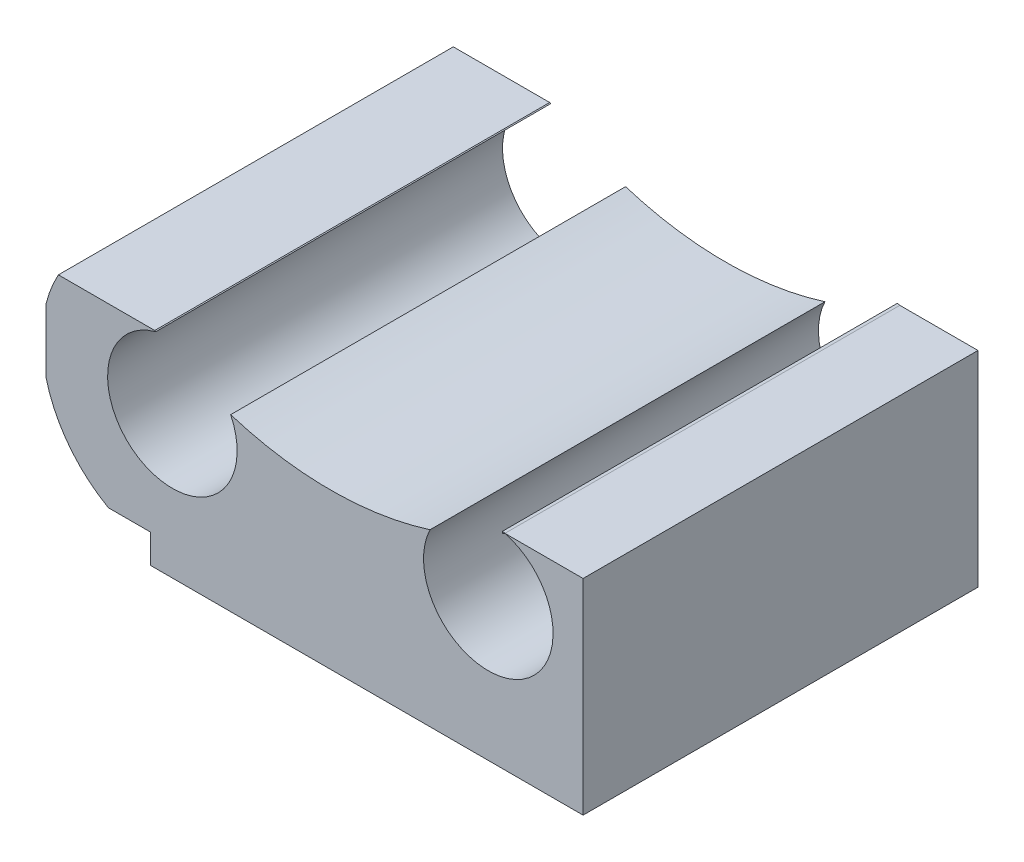
ISO-10303-21;
HEADER;
FILE_DESCRIPTION(('STEP AP214'),'2;1');
FILE_NAME('part.step','',(''),(''),'','','');
FILE_SCHEMA(('AUTOMOTIVE_DESIGN { 1 0 10303 214 1 1 1 1 }'));
ENDSEC;
DATA;
#1=APPLICATION_CONTEXT('core data for automotive mechanical design processes');
#2=APPLICATION_PROTOCOL_DEFINITION('international standard','automotive_design',2000,#1);
#3=PRODUCT_CONTEXT('',#1,'mechanical');
#4=PRODUCT('Part','Part','',(#3));
#5=PRODUCT_RELATED_PRODUCT_CATEGORY('part','',(#4));
#6=PRODUCT_DEFINITION_FORMATION('','',#4);
#7=PRODUCT_DEFINITION_CONTEXT('part definition',#1,'design');
#8=PRODUCT_DEFINITION('design','',#6,#7);
#9=PRODUCT_DEFINITION_SHAPE('','',#8);
#10=(LENGTH_UNIT() NAMED_UNIT(*) SI_UNIT(.MILLI.,.METRE.));
#11=(NAMED_UNIT(*) PLANE_ANGLE_UNIT() SI_UNIT($,.RADIAN.));
#12=(NAMED_UNIT(*) SI_UNIT($,.STERADIAN.) SOLID_ANGLE_UNIT());
#13=UNCERTAINTY_MEASURE_WITH_UNIT(LENGTH_MEASURE(1.E-05),#10,'distance_accuracy_value','');
#14=(GEOMETRIC_REPRESENTATION_CONTEXT(3) GLOBAL_UNCERTAINTY_ASSIGNED_CONTEXT((#13)) GLOBAL_UNIT_ASSIGNED_CONTEXT((#10,
#11,#12)) REPRESENTATION_CONTEXT('',''));
#15=CARTESIAN_POINT('',(0.,0.,0.));
#16=DIRECTION('',(0.,0.,1.));
#17=DIRECTION('',(1.,0.,0.));
#18=AXIS2_PLACEMENT_3D('',#15,#16,#17);
#19=CARTESIAN_POINT('',(0.,-30.8329886663461,0.));
#20=DIRECTION('',(0.,-1.,0.));
#21=DIRECTION('',(0.,0.,-1.));
#22=AXIS2_PLACEMENT_3D('',#19,#20,#21);
#23=PLANE('',#22);
#24=DIRECTION('',(0.,0.,1.));
#25=VECTOR('',#24,1.);
#26=CARTESIAN_POINT('',(-6.,-30.8329886663461,-12.5));
#27=LINE('',#26,#25);
#28=CARTESIAN_POINT('',(-6.,-30.8329886663461,-12.5));
#29=VERTEX_POINT('',#28);
#30=CARTESIAN_POINT('',(-6.00000000000001,-30.832988666346,12.5));
#31=VERTEX_POINT('',#30);
#32=EDGE_CURVE('E253',#29,#31,#27,.T.);
#33=ORIENTED_EDGE('',*,*,#32,.F.);
#34=DIRECTION('',(1.,0.,0.));
#35=VECTOR('',#34,1.);
#36=CARTESIAN_POINT('',(13.6,-30.8329886663461,-12.5));
#37=LINE('',#36,#35);
#38=CARTESIAN_POINT('',(16.,-30.8329886663461,-12.5));
#39=VERTEX_POINT('',#38);
#40=EDGE_CURVE('E262',#29,#39,#37,.T.);
#41=ORIENTED_EDGE('',*,*,#40,.T.);
#42=DIRECTION('',(0.,0.,-1.));
#43=VECTOR('',#42,1.);
#44=CARTESIAN_POINT('',(16.,-30.8329886663461,0.));
#45=LINE('',#44,#43);
#46=CARTESIAN_POINT('',(16.,-30.8329886663461,12.5));
#47=VERTEX_POINT('',#46);
#48=EDGE_CURVE('E395',#47,#39,#45,.T.);
#49=ORIENTED_EDGE('',*,*,#48,.F.);
#50=DIRECTION('',(-1.,0.,0.));
#51=VECTOR('',#50,1.);
#52=CARTESIAN_POINT('',(26.,-30.8329886663461,12.5));
#53=LINE('',#52,#51);
#54=EDGE_CURVE('E265',#47,#31,#53,.T.);
#55=ORIENTED_EDGE('',*,*,#54,.T.);
#56=EDGE_LOOP('',(#33,#41,#49,#55));
#57=FACE_BOUND('',#56,.T.);
#58=ADVANCED_FACE('F115',(#57),#23,.T.);
#59=CARTESIAN_POINT('',(18.,-30.,0.));
#60=DIRECTION('',(0.,0.996849702916543,-0.0793137427890037));
#61=DIRECTION('',(0.,0.0793137427890038,0.996849702916543));
#62=AXIS2_PLACEMENT_3D('',#59,#60,#61);
#63=PLANE('',#62);
#64=DIRECTION('',(0.,-0.0793137427890038,-0.996849702916543));
#65=VECTOR('',#64,1.);
#66=CARTESIAN_POINT('',(-11.4,-30.,0.));
#67=LINE('',#66,#65);
#68=CARTESIAN_POINT('',(-11.4,-29.0054450716473,12.5));
#69=VERTEX_POINT('',#68);
#70=CARTESIAN_POINT('',(-11.4,-29.947768625421,0.656466690401342));
#71=VERTEX_POINT('',#70);
#72=EDGE_CURVE('E435',#69,#71,#67,.T.);
#73=ORIENTED_EDGE('',*,*,#72,.F.);
#74=DIRECTION('',(-1.,0.,0.));
#75=VECTOR('',#74,1.);
#76=CARTESIAN_POINT('',(18.,-29.0054450716473,12.5));
#77=LINE('',#76,#75);
#78=CARTESIAN_POINT('',(-14.0490562319595,-29.0054450716473,12.5));
#79=VERTEX_POINT('',#78);
#80=EDGE_CURVE('E345',#69,#79,#77,.T.);
#81=ORIENTED_EDGE('',*,*,#80,.T.);
#82=CARTESIAN_POINT('',(-10.,-21.8174242292714,102.842180173519));
#83=DIRECTION('',(0.,0.996849702916543,-0.0793137427890037));
#84=DIRECTION('',(0.,0.0793137427890038,0.996849702916543));
#85=AXIS2_PLACEMENT_3D('',#82,#83,#84);
#86=ELLIPSE('',#85,104.0172826284,8.25);
#87=EDGE_CURVE('E350',#71,#79,#86,.T.);
#88=ORIENTED_EDGE('',*,*,#87,.F.);
#89=EDGE_LOOP('',(#73,#81,#88));
#90=FACE_BOUND('',#89,.T.);
#91=ADVANCED_FACE('F463',(#90),#63,.F.);
#92=CARTESIAN_POINT('',(18.,-30.,0.));
#93=DIRECTION('',(0.,0.996849702916543,0.0793137427890037));
#94=DIRECTION('',(0.,-0.0793137427890038,0.996849702916543));
#95=AXIS2_PLACEMENT_3D('',#92,#93,#94);
#96=PLANE('',#95);
#97=DIRECTION('',(0.,0.0793137427890038,-0.996849702916543));
#98=VECTOR('',#97,1.);
#99=CARTESIAN_POINT('',(-11.4,-30.,0.));
#100=LINE('',#99,#98);
#101=CARTESIAN_POINT('',(-11.4,-29.947768625421,-0.656466690401328));
#102=VERTEX_POINT('',#101);
#103=CARTESIAN_POINT('',(-11.4,-29.0054450716473,-12.5));
#104=VERTEX_POINT('',#103);
#105=EDGE_CURVE('E432',#102,#104,#100,.T.);
#106=ORIENTED_EDGE('',*,*,#105,.F.);
#107=CARTESIAN_POINT('',(-10.,-21.8174242292714,-102.842180173519));
#108=DIRECTION('',(0.,0.996849702916543,0.0793137427890037));
#109=DIRECTION('',(0.,-0.0793137427890038,0.996849702916543));
#110=AXIS2_PLACEMENT_3D('',#107,#108,#109);
#111=ELLIPSE('',#110,104.0172826284,8.25);
#112=CARTESIAN_POINT('',(-14.0490562319595,-29.0054450716473,-12.5));
#113=VERTEX_POINT('',#112);
#114=EDGE_CURVE('E353',#113,#102,#111,.T.);
#115=ORIENTED_EDGE('',*,*,#114,.F.);
#116=DIRECTION('',(1.,0.,0.));
#117=VECTOR('',#116,1.);
#118=CARTESIAN_POINT('',(18.,-29.0054450716473,-12.5));
#119=LINE('',#118,#117);
#120=EDGE_CURVE('E315',#113,#104,#119,.T.);
#121=ORIENTED_EDGE('',*,*,#120,.T.);
#122=EDGE_LOOP('',(#106,#115,#121));
#123=FACE_BOUND('',#122,.T.);
#124=ADVANCED_FACE('F471',(#123),#96,.F.);
#125=CARTESIAN_POINT('',(-10.,-21.8174242292714,-40.));
#126=DIRECTION('',(0.,0.,1.));
#127=DIRECTION('',(1.,0.,0.));
#128=AXIS2_PLACEMENT_3D('',#125,#126,#127);
#129=CYLINDRICAL_SURFACE('',#128,8.25);
#130=ORIENTED_EDGE('',*,*,#114,.T.);
#131=DIRECTION('',(0.,0.,1.));
#132=VECTOR('',#131,1.);
#133=CARTESIAN_POINT('',(-11.4,-29.947768625421,-40.));
#134=LINE('',#133,#132);
#135=EDGE_CURVE('E428',#102,#71,#134,.T.);
#136=ORIENTED_EDGE('',*,*,#135,.T.);
#137=ORIENTED_EDGE('',*,*,#87,.T.);
#138=CARTESIAN_POINT('',(-10.,-21.8174242292714,12.5));
#139=DIRECTION('',(0.,0.,-1.));
#140=DIRECTION('',(0.,1.,0.));
#141=AXIS2_PLACEMENT_3D('',#138,#139,#140);
#142=CIRCLE('',#141,8.25);
#143=CARTESIAN_POINT('',(-18.,-23.8329886663461,12.5));
#144=VERTEX_POINT('',#143);
#145=EDGE_CURVE('E341',#144,#79,#142,.F.);
#146=ORIENTED_EDGE('',*,*,#145,.F.);
#147=DIRECTION('',(0.,0.,1.));
#148=VECTOR('',#147,1.);
#149=CARTESIAN_POINT('',(-18.,-23.8329886663461,-40.));
#150=LINE('',#149,#148);
#151=CARTESIAN_POINT('',(-18.,-23.8329886663461,-12.5));
#152=VERTEX_POINT('',#151);
#153=EDGE_CURVE('E354',#152,#144,#150,.T.);
#154=ORIENTED_EDGE('',*,*,#153,.F.);
#155=CARTESIAN_POINT('',(-10.,-21.8174242292714,-12.5));
#156=DIRECTION('',(0.,0.,1.));
#157=DIRECTION('',(0.,-1.,0.));
#158=AXIS2_PLACEMENT_3D('',#155,#156,#157);
#159=CIRCLE('',#158,8.25);
#160=EDGE_CURVE('E312',#113,#152,#159,.F.);
#161=ORIENTED_EDGE('',*,*,#160,.F.);
#162=EDGE_LOOP('',(#130,#136,#137,#146,#154,#161));
#163=FACE_BOUND('',#162,.T.);
#164=ADVANCED_FACE('F466',(#163),#129,.T.);
#165=CARTESIAN_POINT('',(18.,-17.8174242292714,40.));
#166=DIRECTION('',(0.,-1.,0.));
#167=DIRECTION('',(0.,0.,-1.));
#168=AXIS2_PLACEMENT_3D('',#165,#166,#167);
#169=PLANE('',#168);
#170=DIRECTION('',(0.,0.,1.));
#171=VECTOR('',#170,1.);
#172=CARTESIAN_POINT('',(-17.2154348448309,-17.8174242292714,-40.));
#173=LINE('',#172,#171);
#174=CARTESIAN_POINT('',(-17.2154348448309,-17.8174242292714,-12.5));
#175=VERTEX_POINT('',#174);
#176=CARTESIAN_POINT('',(-17.2154348448309,-17.8174242292714,12.5));
#177=VERTEX_POINT('',#176);
#178=EDGE_CURVE('E362',#175,#177,#173,.T.);
#179=ORIENTED_EDGE('',*,*,#178,.T.);
#180=DIRECTION('',(1.,0.,0.));
#181=VECTOR('',#180,1.);
#182=CARTESIAN_POINT('',(18.,-17.8174242292714,12.5));
#183=LINE('',#182,#181);
#184=CARTESIAN_POINT('',(-11.1148276565213,-17.8174242292714,12.5));
#185=VERTEX_POINT('',#184);
#186=EDGE_CURVE('E323',#177,#185,#183,.T.);
#187=ORIENTED_EDGE('',*,*,#186,.T.);
#188=DIRECTION('',(0.,0.,1.));
#189=VECTOR('',#188,1.);
#190=CARTESIAN_POINT('',(-11.1148276565214,-17.8174242292714,-40.));
#191=LINE('',#190,#189);
#192=CARTESIAN_POINT('',(-11.1148276565214,-17.8174242292714,-12.5));
#193=VERTEX_POINT('',#192);
#194=EDGE_CURVE('E349',#185,#193,#191,.F.);
#195=ORIENTED_EDGE('',*,*,#194,.T.);
#196=DIRECTION('',(-1.,0.,0.));
#197=VECTOR('',#196,1.);
#198=CARTESIAN_POINT('',(18.,-17.8174242292714,-12.5));
#199=LINE('',#198,#197);
#200=EDGE_CURVE('E294',#193,#175,#199,.T.);
#201=ORIENTED_EDGE('',*,*,#200,.T.);
#202=EDGE_LOOP('',(#179,#187,#195,#201));
#203=FACE_BOUND('',#202,.T.);
#204=ADVANCED_FACE('F573',(#203),#169,.F.);
#205=CARTESIAN_POINT('',(-18.,0.,0.));
#206=DIRECTION('',(-1.,0.,0.));
#207=DIRECTION('',(0.,0.,1.));
#208=AXIS2_PLACEMENT_3D('',#205,#206,#207);
#209=PLANE('',#208);
#210=DIRECTION('',(0.,-1.,0.));
#211=VECTOR('',#210,1.);
#212=CARTESIAN_POINT('',(-18.,0.,12.5));
#213=LINE('',#212,#211);
#214=CARTESIAN_POINT('',(-18.,-19.8018597921968,12.5));
#215=VERTEX_POINT('',#214);
#216=EDGE_CURVE('E338',#215,#144,#213,.T.);
#217=ORIENTED_EDGE('',*,*,#216,.F.);
#218=DIRECTION('',(0.,0.,1.));
#219=VECTOR('',#218,1.);
#220=CARTESIAN_POINT('',(-18.,-19.8018597921968,-40.));
#221=LINE('',#220,#219);
#222=CARTESIAN_POINT('',(-18.,-19.8018597921968,-12.5));
#223=VERTEX_POINT('',#222);
#224=EDGE_CURVE('E358',#223,#215,#221,.T.);
#225=ORIENTED_EDGE('',*,*,#224,.F.);
#226=DIRECTION('',(0.,1.,0.));
#227=VECTOR('',#226,1.);
#228=CARTESIAN_POINT('',(-18.,0.,-12.5));
#229=LINE('',#228,#227);
#230=EDGE_CURVE('E309',#152,#223,#229,.T.);
#231=ORIENTED_EDGE('',*,*,#230,.F.);
#232=ORIENTED_EDGE('',*,*,#153,.T.);
#233=EDGE_LOOP('',(#217,#225,#231,#232));
#234=FACE_BOUND('',#233,.T.);
#235=ADVANCED_FACE('F576',(#234),#209,.T.);
#236=CARTESIAN_POINT('',(-10.,-21.8174242292714,-40.));
#237=DIRECTION('',(0.,0.,1.));
#238=DIRECTION('',(1.,0.,0.));
#239=AXIS2_PLACEMENT_3D('',#236,#237,#238);
#240=CYLINDRICAL_SURFACE('',#239,8.25);
#241=CARTESIAN_POINT('',(-10.,-21.8174242292714,12.5));
#242=DIRECTION('',(0.,0.,-1.));
#243=DIRECTION('',(0.,1.,0.));
#244=AXIS2_PLACEMENT_3D('',#241,#242,#243);
#245=CIRCLE('',#244,8.25);
#246=EDGE_CURVE('E335',#177,#215,#245,.F.);
#247=ORIENTED_EDGE('',*,*,#246,.F.);
#248=ORIENTED_EDGE('',*,*,#178,.F.);
#249=CARTESIAN_POINT('',(-10.,-21.8174242292714,-12.5));
#250=DIRECTION('',(0.,0.,1.));
#251=DIRECTION('',(0.,-1.,0.));
#252=AXIS2_PLACEMENT_3D('',#249,#250,#251);
#253=CIRCLE('',#252,8.25);
#254=EDGE_CURVE('E306',#223,#175,#253,.F.);
#255=ORIENTED_EDGE('',*,*,#254,.F.);
#256=ORIENTED_EDGE('',*,*,#224,.T.);
#257=EDGE_LOOP('',(#247,#248,#255,#256));
#258=FACE_BOUND('',#257,.T.);
#259=ADVANCED_FACE('F580',(#258),#240,.T.);
#260=CARTESIAN_POINT('',(10.,-21.8174242292714,-40.));
#261=DIRECTION('',(0.,0.,1.));
#262=DIRECTION('',(1.,0.,0.));
#263=AXIS2_PLACEMENT_3D('',#260,#261,#262);
#264=CYLINDRICAL_SURFACE('',#263,4.1);
#265=DIRECTION('',(0.,0.,1.));
#266=VECTOR('',#265,1.);
#267=CARTESIAN_POINT('',(6.31040022148218,-20.0294495442266,-40.));
#268=LINE('',#267,#266);
#269=CARTESIAN_POINT('',(6.31040022148218,-20.0294495442266,-12.5));
#270=VERTEX_POINT('',#269);
#271=CARTESIAN_POINT('',(6.31040022148218,-20.0294495442266,12.5));
#272=VERTEX_POINT('',#271);
#273=EDGE_CURVE('E369',#270,#272,#268,.T.);
#274=ORIENTED_EDGE('',*,*,#273,.T.);
#275=CARTESIAN_POINT('',(10.,-21.8174242292714,12.5));
#276=DIRECTION('',(0.,0.,-1.));
#277=DIRECTION('',(0.,1.,0.));
#278=AXIS2_PLACEMENT_3D('',#275,#276,#277);
#279=CIRCLE('',#278,4.1);
#280=CARTESIAN_POINT('',(11.05400950074,-17.8552197958342,12.5));
#281=VERTEX_POINT('',#280);
#282=EDGE_CURVE('E331',#272,#281,#279,.F.);
#283=ORIENTED_EDGE('',*,*,#282,.T.);
#284=DIRECTION('',(0.,0.,1.));
#285=VECTOR('',#284,1.);
#286=CARTESIAN_POINT('',(11.05400950074,-17.8552197958342,-40.));
#287=LINE('',#286,#285);
#288=CARTESIAN_POINT('',(11.05400950074,-17.8552197958342,-12.5));
#289=VERTEX_POINT('',#288);
#290=EDGE_CURVE('E381',#289,#281,#287,.T.);
#291=ORIENTED_EDGE('',*,*,#290,.F.);
#292=CARTESIAN_POINT('',(10.,-21.8174242292714,-12.5));
#293=DIRECTION('',(0.,0.,1.));
#294=DIRECTION('',(0.,-1.,0.));
#295=AXIS2_PLACEMENT_3D('',#292,#293,#294);
#296=CIRCLE('',#295,4.1);
#297=EDGE_CURVE('E302',#289,#270,#296,.F.);
#298=ORIENTED_EDGE('',*,*,#297,.T.);
#299=EDGE_LOOP('',(#274,#283,#291,#298));
#300=FACE_BOUND('',#299,.T.);
#301=ADVANCED_FACE('F586',(#300),#264,.F.);
#302=CARTESIAN_POINT('',(-10.,-21.8174242292714,-40.));
#303=DIRECTION('',(0.,0.,1.));
#304=DIRECTION('',(1.,0.,0.));
#305=AXIS2_PLACEMENT_3D('',#302,#303,#304);
#306=CYLINDRICAL_SURFACE('',#305,4.1);
#307=DIRECTION('',(0.,0.,1.));
#308=VECTOR('',#307,1.);
#309=CARTESIAN_POINT('',(-11.05400950074,-17.8552197958342,0.));
#310=LINE('',#309,#308);
#311=CARTESIAN_POINT('',(-11.05400950074,-17.8552197958342,-12.5));
#312=VERTEX_POINT('',#311);
#313=CARTESIAN_POINT('',(-11.05400950074,-17.8552197958342,12.5));
#314=VERTEX_POINT('',#313);
#315=EDGE_CURVE('E373',#312,#314,#310,.T.);
#316=ORIENTED_EDGE('',*,*,#315,.T.);
#317=CARTESIAN_POINT('',(-10.,-21.8174242292714,12.5));
#318=DIRECTION('',(0.,0.,-1.));
#319=DIRECTION('',(0.,1.,0.));
#320=AXIS2_PLACEMENT_3D('',#317,#318,#319);
#321=CIRCLE('',#320,4.1);
#322=CARTESIAN_POINT('',(-6.31040022148218,-20.0294495442266,12.5));
#323=VERTEX_POINT('',#322);
#324=EDGE_CURVE('E319',#314,#323,#321,.F.);
#325=ORIENTED_EDGE('',*,*,#324,.T.);
#326=DIRECTION('',(0.,0.,1.));
#327=VECTOR('',#326,1.);
#328=CARTESIAN_POINT('',(-6.31040022148218,-20.0294495442266,0.));
#329=LINE('',#328,#327);
#330=CARTESIAN_POINT('',(-6.31040022148218,-20.0294495442266,-12.5));
#331=VERTEX_POINT('',#330);
#332=EDGE_CURVE('E377',#323,#331,#329,.F.);
#333=ORIENTED_EDGE('',*,*,#332,.T.);
#334=CARTESIAN_POINT('',(-10.,-21.8174242292714,-12.5));
#335=DIRECTION('',(0.,0.,1.));
#336=DIRECTION('',(0.,-1.,0.));
#337=AXIS2_PLACEMENT_3D('',#334,#335,#336);
#338=CIRCLE('',#337,4.1);
#339=EDGE_CURVE('E290',#331,#312,#338,.F.);
#340=ORIENTED_EDGE('',*,*,#339,.T.);
#341=EDGE_LOOP('',(#316,#325,#333,#340));
#342=FACE_BOUND('',#341,.T.);
#343=ADVANCED_FACE('F588',(#342),#306,.F.);
#344=CARTESIAN_POINT('',(10.9,12.5,12.5));
#345=DIRECTION('',(0.,0.,1.));
#346=DIRECTION('',(0.,-1.,0.));
#347=AXIS2_PLACEMENT_3D('',#344,#345,#346);
#348=PLANE('',#347);
#349=DIRECTION('',(1.,0.,0.));
#350=VECTOR('',#349,1.);
#351=CARTESIAN_POINT('',(-21.,-30.832988666346,12.5));
#352=LINE('',#351,#350);
#353=CARTESIAN_POINT('',(-11.,-30.832988666346,12.5));
#354=VERTEX_POINT('',#353);
#355=EDGE_CURVE('E257',#354,#31,#352,.T.);
#356=ORIENTED_EDGE('',*,*,#355,.T.);
#357=ORIENTED_EDGE('',*,*,#54,.F.);
#358=DIRECTION('',(0.,-1.,0.));
#359=VECTOR('',#358,1.);
#360=CARTESIAN_POINT('',(16.,-30.8329886663461,12.5));
#361=LINE('',#360,#359);
#362=CARTESIAN_POINT('',(16.,-17.8552197958342,12.5));
#363=VERTEX_POINT('',#362);
#364=EDGE_CURVE('E438',#363,#47,#361,.T.);
#365=ORIENTED_EDGE('',*,*,#364,.F.);
#366=DIRECTION('',(1.,0.,0.));
#367=VECTOR('',#366,1.);
#368=CARTESIAN_POINT('',(11.05400950074,-17.8552197958342,12.5));
#369=LINE('',#368,#367);
#370=EDGE_CURVE('E279',#281,#363,#369,.T.);
#371=ORIENTED_EDGE('',*,*,#370,.F.);
#372=ORIENTED_EDGE('',*,*,#282,.F.);
#373=CARTESIAN_POINT('',(0.,0.,12.5));
#374=DIRECTION('',(0.,0.,-1.));
#375=DIRECTION('',(0.,1.,0.));
#376=AXIS2_PLACEMENT_3D('',#373,#374,#375);
#377=CIRCLE('',#376,21.);
#378=EDGE_CURVE('E327',#323,#272,#377,.F.);
#379=ORIENTED_EDGE('',*,*,#378,.F.);
#380=ORIENTED_EDGE('',*,*,#324,.F.);
#381=CARTESIAN_POINT('',(0.,0.,12.5));
#382=DIRECTION('',(0.,0.,-1.));
#383=DIRECTION('',(0.,1.,0.));
#384=AXIS2_PLACEMENT_3D('',#381,#382,#383);
#385=CIRCLE('',#384,21.);
#386=EDGE_CURVE('E391',#185,#314,#385,.F.);
#387=ORIENTED_EDGE('',*,*,#386,.F.);
#388=ORIENTED_EDGE('',*,*,#186,.F.);
#389=ORIENTED_EDGE('',*,*,#246,.T.);
#390=ORIENTED_EDGE('',*,*,#216,.T.);
#391=ORIENTED_EDGE('',*,*,#145,.T.);
#392=ORIENTED_EDGE('',*,*,#80,.F.);
#393=DIRECTION('',(0.,1.,0.));
#394=VECTOR('',#393,1.);
#395=CARTESIAN_POINT('',(-11.4,-29.0054450716473,12.5));
#396=LINE('',#395,#394);
#397=CARTESIAN_POINT('',(-11.4,-30.8329886663461,12.5));
#398=VERTEX_POINT('',#397);
#399=EDGE_CURVE('E409',#398,#69,#396,.T.);
#400=ORIENTED_EDGE('',*,*,#399,.F.);
#401=EDGE_CURVE('E280',#354,#398,#53,.T.);
#402=ORIENTED_EDGE('',*,*,#401,.F.);
#403=EDGE_LOOP('',(#356,#357,#365,#371,#372,#379,#380,#387,#388,#389,#390,#391,#392,#400,#402));
#404=FACE_BOUND('',#403,.T.);
#405=ADVANCED_FACE('F459',(#404),#348,.T.);
#406=CARTESIAN_POINT('',(10.9,12.5,-12.5));
#407=DIRECTION('',(0.,0.,-1.));
#408=DIRECTION('',(0.,1.,0.));
#409=AXIS2_PLACEMENT_3D('',#406,#407,#408);
#410=PLANE('',#409);
#411=DIRECTION('',(1.,0.,0.));
#412=VECTOR('',#411,1.);
#413=CARTESIAN_POINT('',(-21.,-30.8329886663461,-12.5));
#414=LINE('',#413,#412);
#415=CARTESIAN_POINT('',(-11.,-30.8329886663461,-12.5));
#416=VERTEX_POINT('',#415);
#417=EDGE_CURVE('E238',#416,#29,#414,.T.);
#418=ORIENTED_EDGE('',*,*,#417,.F.);
#419=CARTESIAN_POINT('',(-11.4,-30.8329886663461,-12.5));
#420=VERTEX_POINT('',#419);
#421=EDGE_CURVE('E275',#420,#416,#37,.T.);
#422=ORIENTED_EDGE('',*,*,#421,.F.);
#423=DIRECTION('',(0.,-1.,0.));
#424=VECTOR('',#423,1.);
#425=CARTESIAN_POINT('',(-11.4,-30.8329886663461,-12.5));
#426=LINE('',#425,#424);
#427=EDGE_CURVE('E413',#104,#420,#426,.T.);
#428=ORIENTED_EDGE('',*,*,#427,.F.);
#429=ORIENTED_EDGE('',*,*,#120,.F.);
#430=ORIENTED_EDGE('',*,*,#160,.T.);
#431=ORIENTED_EDGE('',*,*,#230,.T.);
#432=ORIENTED_EDGE('',*,*,#254,.T.);
#433=ORIENTED_EDGE('',*,*,#200,.F.);
#434=CARTESIAN_POINT('',(0.,0.,-12.5));
#435=DIRECTION('',(0.,0.,1.));
#436=DIRECTION('',(0.,-1.,0.));
#437=AXIS2_PLACEMENT_3D('',#434,#435,#436);
#438=CIRCLE('',#437,21.);
#439=EDGE_CURVE('E387',#312,#193,#438,.F.);
#440=ORIENTED_EDGE('',*,*,#439,.F.);
#441=ORIENTED_EDGE('',*,*,#339,.F.);
#442=CARTESIAN_POINT('',(0.,0.,-12.5));
#443=DIRECTION('',(0.,0.,1.));
#444=DIRECTION('',(0.,-1.,0.));
#445=AXIS2_PLACEMENT_3D('',#442,#443,#444);
#446=CIRCLE('',#445,21.);
#447=EDGE_CURVE('E298',#270,#331,#446,.F.);
#448=ORIENTED_EDGE('',*,*,#447,.F.);
#449=ORIENTED_EDGE('',*,*,#297,.F.);
#450=DIRECTION('',(-1.,0.,0.));
#451=VECTOR('',#450,1.);
#452=CARTESIAN_POINT('',(10.9,-17.8552197958342,-12.5));
#453=LINE('',#452,#451);
#454=CARTESIAN_POINT('',(16.,-17.8552197958342,-12.5));
#455=VERTEX_POINT('',#454);
#456=EDGE_CURVE('E287',#455,#289,#453,.T.);
#457=ORIENTED_EDGE('',*,*,#456,.F.);
#458=DIRECTION('',(0.,1.,0.));
#459=VECTOR('',#458,1.);
#460=CARTESIAN_POINT('',(16.,12.5,-12.5));
#461=LINE('',#460,#459);
#462=EDGE_CURVE('E273',#39,#455,#461,.T.);
#463=ORIENTED_EDGE('',*,*,#462,.F.);
#464=ORIENTED_EDGE('',*,*,#40,.F.);
#465=EDGE_LOOP('',(#418,#422,#428,#429,#430,#431,#432,#433,#440,#441,#448,#449,#457,#463,#464));
#466=FACE_BOUND('',#465,.T.);
#467=ADVANCED_FACE('F271',(#466),#410,.T.);
#468=CARTESIAN_POINT('',(0.,0.,-40.));
#469=DIRECTION('',(0.,0.,1.));
#470=DIRECTION('',(1.,0.,0.));
#471=AXIS2_PLACEMENT_3D('',#468,#469,#470);
#472=CYLINDRICAL_SURFACE('',#471,21.);
#473=ORIENTED_EDGE('',*,*,#332,.F.);
#474=ORIENTED_EDGE('',*,*,#378,.T.);
#475=ORIENTED_EDGE('',*,*,#273,.F.);
#476=ORIENTED_EDGE('',*,*,#447,.T.);
#477=EDGE_LOOP('',(#473,#474,#475,#476));
#478=FACE_BOUND('',#477,.T.);
#479=ADVANCED_FACE('F568',(#478),#472,.F.);
#480=ORIENTED_EDGE('',*,*,#194,.F.);
#481=ORIENTED_EDGE('',*,*,#386,.T.);
#482=ORIENTED_EDGE('',*,*,#315,.F.);
#483=ORIENTED_EDGE('',*,*,#439,.T.);
#484=EDGE_LOOP('',(#480,#481,#482,#483));
#485=FACE_BOUND('',#484,.T.);
#486=ADVANCED_FACE('F117',(#485),#472,.F.);
#487=CARTESIAN_POINT('',(11.05400950074,-17.8552197958342,-57.5));
#488=DIRECTION('',(0.,-1.,0.));
#489=DIRECTION('',(0.,0.,-1.));
#490=AXIS2_PLACEMENT_3D('',#487,#488,#489);
#491=PLANE('',#490);
#492=ORIENTED_EDGE('',*,*,#370,.T.);
#493=DIRECTION('',(0.,0.,1.));
#494=VECTOR('',#493,1.);
#495=CARTESIAN_POINT('',(16.,-17.8552197958342,-27.5));
#496=LINE('',#495,#494);
#497=EDGE_CURVE('E441',#455,#363,#496,.T.);
#498=ORIENTED_EDGE('',*,*,#497,.F.);
#499=ORIENTED_EDGE('',*,*,#456,.T.);
#500=ORIENTED_EDGE('',*,*,#290,.T.);
#501=EDGE_LOOP('',(#492,#498,#499,#500));
#502=FACE_BOUND('',#501,.T.);
#503=ADVANCED_FACE('F559',(#502),#491,.F.);
#504=DIRECTION('',(0.,0.,-1.));
#505=VECTOR('',#504,1.);
#506=CARTESIAN_POINT('',(-11.,-30.8329886663461,12.5));
#507=LINE('',#506,#505);
#508=EDGE_CURVE('E268',#354,#416,#507,.T.);
#509=ORIENTED_EDGE('',*,*,#508,.F.);
#510=ORIENTED_EDGE('',*,*,#401,.T.);
#511=DIRECTION('',(0.,0.,1.));
#512=VECTOR('',#511,1.);
#513=CARTESIAN_POINT('',(-11.4,-30.8329886663461,12.5));
#514=LINE('',#513,#512);
#515=EDGE_CURVE('E424',#420,#398,#514,.T.);
#516=ORIENTED_EDGE('',*,*,#515,.F.);
#517=ORIENTED_EDGE('',*,*,#421,.T.);
#518=EDGE_LOOP('',(#509,#510,#516,#517));
#519=FACE_BOUND('',#518,.T.);
#520=ADVANCED_FACE('F451',(#519),#23,.T.);
#521=CARTESIAN_POINT('',(16.,-30.8329886663461,-27.5));
#522=DIRECTION('',(-1.,0.,0.));
#523=DIRECTION('',(0.,0.,1.));
#524=AXIS2_PLACEMENT_3D('',#521,#522,#523);
#525=PLANE('',#524);
#526=ORIENTED_EDGE('',*,*,#462,.T.);
#527=ORIENTED_EDGE('',*,*,#497,.T.);
#528=ORIENTED_EDGE('',*,*,#364,.T.);
#529=ORIENTED_EDGE('',*,*,#48,.T.);
#530=EDGE_LOOP('',(#526,#527,#528,#529));
#531=FACE_BOUND('',#530,.T.);
#532=ADVANCED_FACE('F547',(#531),#525,.F.);
#533=CARTESIAN_POINT('',(-11.4,0.,0.));
#534=DIRECTION('',(1.,0.,0.));
#535=DIRECTION('',(0.,0.,-1.));
#536=AXIS2_PLACEMENT_3D('',#533,#534,#535);
#537=PLANE('',#536);
#538=ORIENTED_EDGE('',*,*,#399,.T.);
#539=ORIENTED_EDGE('',*,*,#72,.T.);
#540=ORIENTED_EDGE('',*,*,#135,.F.);
#541=ORIENTED_EDGE('',*,*,#105,.T.);
#542=ORIENTED_EDGE('',*,*,#427,.T.);
#543=ORIENTED_EDGE('',*,*,#515,.T.);
#544=EDGE_LOOP('',(#538,#539,#540,#541,#542,#543));
#545=FACE_BOUND('',#544,.T.);
#546=ADVANCED_FACE('F455',(#545),#537,.F.);
#547=CARTESIAN_POINT('',(-11.,-35.8329886663461,12.5));
#548=DIRECTION('',(1.,0.,0.));
#549=DIRECTION('',(0.,0.,-1.));
#550=AXIS2_PLACEMENT_3D('',#547,#548,#549);
#551=PLANE('',#550);
#552=CARTESIAN_POINT('',(-11.,-33.3329886663461,7.5));
#553=DIRECTION('',(1.,0.,0.));
#554=DIRECTION('',(0.,0.,-1.));
#555=AXIS2_PLACEMENT_3D('',#552,#553,#554);
#556=CIRCLE('',#555,0.899999999999998);
#557=CARTESIAN_POINT('',(-11.,-33.3329886663461,6.6));
#558=VERTEX_POINT('',#557);
#559=EDGE_CURVE('E405',#558,#558,#556,.T.);
#560=ORIENTED_EDGE('',*,*,#559,.T.);
#561=EDGE_LOOP('',(#560));
#562=FACE_BOUND('',#561,.T.);
#563=CARTESIAN_POINT('',(-11.,-33.3329886663461,3.75));
#564=DIRECTION('',(1.,0.,0.));
#565=DIRECTION('',(0.,0.,-1.));
#566=AXIS2_PLACEMENT_3D('',#563,#564,#565);
#567=CIRCLE('',#566,0.899999999999998);
#568=CARTESIAN_POINT('',(-11.,-33.3329886663461,2.85000000000001));
#569=VERTEX_POINT('',#568);
#570=EDGE_CURVE('E483',#569,#569,#567,.T.);
#571=ORIENTED_EDGE('',*,*,#570,.T.);
#572=EDGE_LOOP('',(#571));
#573=FACE_BOUND('',#572,.T.);
#574=CARTESIAN_POINT('',(-11.,-33.3329886663461,0.));
#575=DIRECTION('',(1.,0.,0.));
#576=DIRECTION('',(0.,0.,-1.));
#577=AXIS2_PLACEMENT_3D('',#574,#575,#576);
#578=CIRCLE('',#577,0.899999999999998);
#579=CARTESIAN_POINT('',(-11.,-33.3329886663461,-0.89999999999999));
#580=VERTEX_POINT('',#579);
#581=EDGE_CURVE('E487',#580,#580,#578,.T.);
#582=ORIENTED_EDGE('',*,*,#581,.T.);
#583=EDGE_LOOP('',(#582));
#584=FACE_BOUND('',#583,.T.);
#585=CARTESIAN_POINT('',(-11.,-33.3329886663461,-3.74999999999999));
#586=DIRECTION('',(1.,0.,0.));
#587=DIRECTION('',(0.,0.,-1.));
#588=AXIS2_PLACEMENT_3D('',#585,#586,#587);
#589=CIRCLE('',#588,0.899999999999998);
#590=CARTESIAN_POINT('',(-11.,-33.3329886663461,-4.64999999999999));
#591=VERTEX_POINT('',#590);
#592=EDGE_CURVE('E491',#591,#591,#589,.T.);
#593=ORIENTED_EDGE('',*,*,#592,.T.);
#594=EDGE_LOOP('',(#593));
#595=FACE_BOUND('',#594,.T.);
#596=CARTESIAN_POINT('',(-11.,-33.3329886663461,-7.49999999999999));
#597=DIRECTION('',(1.,0.,0.));
#598=DIRECTION('',(0.,0.,-1.));
#599=AXIS2_PLACEMENT_3D('',#596,#597,#598);
#600=CIRCLE('',#599,0.9);
#601=CARTESIAN_POINT('',(-11.,-33.3329886663461,-8.39999999999999));
#602=VERTEX_POINT('',#601);
#603=EDGE_CURVE('E495',#602,#602,#600,.T.);
#604=ORIENTED_EDGE('',*,*,#603,.T.);
#605=EDGE_LOOP('',(#604));
#606=FACE_BOUND('',#605,.T.);
#607=ORIENTED_EDGE('',*,*,#508,.T.);
#608=DIRECTION('',(0.,-0.640184399664479,0.768221279597376));
#609=VECTOR('',#608,1.);
#610=CARTESIAN_POINT('',(-11.,-45.1772509614281,4.71311475409836));
#611=LINE('',#610,#609);
#612=CARTESIAN_POINT('',(-11.,-35.8329886663461,-6.50000000000002));
#613=VERTEX_POINT('',#612);
#614=EDGE_CURVE('E241',#416,#613,#611,.T.);
#615=ORIENTED_EDGE('',*,*,#614,.T.);
#616=DIRECTION('',(0.,0.,-1.));
#617=VECTOR('',#616,1.);
#618=CARTESIAN_POINT('',(-11.,-35.8329886663461,12.5));
#619=LINE('',#618,#617);
#620=CARTESIAN_POINT('',(-11.,-35.8329886663461,6.49999999999999));
#621=VERTEX_POINT('',#620);
#622=EDGE_CURVE('E267',#621,#613,#619,.T.);
#623=ORIENTED_EDGE('',*,*,#622,.F.);
#624=DIRECTION('',(0.,0.640184399664482,0.768221279597375));
#625=VECTOR('',#624,1.);
#626=CARTESIAN_POINT('',(-11.,-32.8821689942149,10.0409836065574));
#627=LINE('',#626,#625);
#628=EDGE_CURVE('E138',#621,#354,#627,.T.);
#629=ORIENTED_EDGE('',*,*,#628,.T.);
#630=EDGE_LOOP('',(#607,#615,#623,#629));
#631=FACE_BOUND('',#630,.T.);
#632=ADVANCED_FACE('F473',(#562,#573,#584,#595,#606,#631),#551,.F.);
#633=CARTESIAN_POINT('',(-6.,-35.8329886663461,-12.5));
#634=DIRECTION('',(-1.,0.,0.));
#635=DIRECTION('',(0.,0.,1.));
#636=AXIS2_PLACEMENT_3D('',#633,#634,#635);
#637=PLANE('',#636);
#638=CARTESIAN_POINT('',(-6.,-33.3329886663461,7.5));
#639=DIRECTION('',(1.,0.,0.));
#640=DIRECTION('',(0.,0.,-1.));
#641=AXIS2_PLACEMENT_3D('',#638,#639,#640);
#642=CIRCLE('',#641,0.899999999999998);
#643=CARTESIAN_POINT('',(-6.,-33.3329886663461,6.60000000000001));
#644=VERTEX_POINT('',#643);
#645=EDGE_CURVE('E499',#644,#644,#642,.T.);
#646=ORIENTED_EDGE('',*,*,#645,.F.);
#647=EDGE_LOOP('',(#646));
#648=FACE_BOUND('',#647,.T.);
#649=CARTESIAN_POINT('',(-6.,-33.3329886663461,3.75000000000001));
#650=DIRECTION('',(1.,0.,0.));
#651=DIRECTION('',(0.,0.,-1.));
#652=AXIS2_PLACEMENT_3D('',#649,#650,#651);
#653=CIRCLE('',#652,0.899999999999998);
#654=CARTESIAN_POINT('',(-6.,-33.3329886663461,2.85000000000001));
#655=VERTEX_POINT('',#654);
#656=EDGE_CURVE('E512',#655,#655,#653,.T.);
#657=ORIENTED_EDGE('',*,*,#656,.F.);
#658=EDGE_LOOP('',(#657));
#659=FACE_BOUND('',#658,.T.);
#660=CARTESIAN_POINT('',(-6.,-33.3329886663461,0.));
#661=DIRECTION('',(1.,0.,0.));
#662=DIRECTION('',(0.,0.,-1.));
#663=AXIS2_PLACEMENT_3D('',#660,#661,#662);
#664=CIRCLE('',#663,0.899999999999998);
#665=CARTESIAN_POINT('',(-6.,-33.3329886663461,-0.899999999999989));
#666=VERTEX_POINT('',#665);
#667=EDGE_CURVE('E508',#666,#666,#664,.T.);
#668=ORIENTED_EDGE('',*,*,#667,.F.);
#669=EDGE_LOOP('',(#668));
#670=FACE_BOUND('',#669,.T.);
#671=CARTESIAN_POINT('',(-6.,-33.3329886663461,-3.74999999999999));
#672=DIRECTION('',(1.,0.,0.));
#673=DIRECTION('',(0.,0.,-1.));
#674=AXIS2_PLACEMENT_3D('',#671,#672,#673);
#675=CIRCLE('',#674,0.899999999999998);
#676=CARTESIAN_POINT('',(-6.,-33.3329886663461,-4.64999999999999));
#677=VERTEX_POINT('',#676);
#678=EDGE_CURVE('E504',#677,#677,#675,.T.);
#679=ORIENTED_EDGE('',*,*,#678,.F.);
#680=EDGE_LOOP('',(#679));
#681=FACE_BOUND('',#680,.T.);
#682=CARTESIAN_POINT('',(-6.,-33.3329886663461,-7.49999999999999));
#683=DIRECTION('',(1.,0.,0.));
#684=DIRECTION('',(0.,0.,-1.));
#685=AXIS2_PLACEMENT_3D('',#682,#683,#684);
#686=CIRCLE('',#685,0.9);
#687=CARTESIAN_POINT('',(-6.,-33.3329886663461,-8.39999999999999));
#688=VERTEX_POINT('',#687);
#689=EDGE_CURVE('E500',#688,#688,#686,.T.);
#690=ORIENTED_EDGE('',*,*,#689,.F.);
#691=EDGE_LOOP('',(#690));
#692=FACE_BOUND('',#691,.T.);
#693=DIRECTION('',(0.,0.,1.));
#694=VECTOR('',#693,1.);
#695=CARTESIAN_POINT('',(-6.,-35.8329886663461,-12.5));
#696=LINE('',#695,#694);
#697=CARTESIAN_POINT('',(-6.,-35.8329886663461,-6.50000000000001));
#698=VERTEX_POINT('',#697);
#699=CARTESIAN_POINT('',(-6.,-35.8329886663461,6.50000000000001));
#700=VERTEX_POINT('',#699);
#701=EDGE_CURVE('E255',#698,#700,#696,.T.);
#702=ORIENTED_EDGE('',*,*,#701,.F.);
#703=DIRECTION('',(0.,-0.640184399664479,0.768221279597376));
#704=VECTOR('',#703,1.);
#705=CARTESIAN_POINT('',(-6.,-30.8329886663461,-12.5));
#706=LINE('',#705,#704);
#707=EDGE_CURVE('E130',#29,#698,#706,.T.);
#708=ORIENTED_EDGE('',*,*,#707,.F.);
#709=ORIENTED_EDGE('',*,*,#32,.T.);
#710=DIRECTION('',(0.,0.640184399664482,0.768221279597375));
#711=VECTOR('',#710,1.);
#712=CARTESIAN_POINT('',(-6.00000000000001,-30.832988666346,12.5));
#713=LINE('',#712,#711);
#714=EDGE_CURVE('E399',#700,#31,#713,.T.);
#715=ORIENTED_EDGE('',*,*,#714,.F.);
#716=EDGE_LOOP('',(#702,#708,#709,#715));
#717=FACE_BOUND('',#716,.T.);
#718=ADVANCED_FACE('F251',(#648,#659,#670,#681,#692,#717),#637,.F.);
#719=CARTESIAN_POINT('',(0.,-35.8329886663461,0.));
#720=DIRECTION('',(0.,-1.,0.));
#721=DIRECTION('',(0.,0.,-1.));
#722=AXIS2_PLACEMENT_3D('',#719,#720,#721);
#723=PLANE('',#722);
#724=DIRECTION('',(-1.,0.,0.));
#725=VECTOR('',#724,1.);
#726=CARTESIAN_POINT('',(0.,-35.8329886663461,-6.50000000000001));
#727=LINE('',#726,#725);
#728=EDGE_CURVE('E13',#698,#613,#727,.T.);
#729=ORIENTED_EDGE('',*,*,#728,.F.);
#730=ORIENTED_EDGE('',*,*,#701,.T.);
#731=DIRECTION('',(1.,0.,0.));
#732=VECTOR('',#731,1.);
#733=CARTESIAN_POINT('',(0.,-35.8329886663461,6.49999999999999));
#734=LINE('',#733,#732);
#735=EDGE_CURVE('E124',#621,#700,#734,.T.);
#736=ORIENTED_EDGE('',*,*,#735,.F.);
#737=ORIENTED_EDGE('',*,*,#622,.T.);
#738=EDGE_LOOP('',(#729,#730,#736,#737));
#739=FACE_BOUND('',#738,.T.);
#740=ADVANCED_FACE('F407',(#739),#723,.T.);
#741=CARTESIAN_POINT('',(-21.,-30.832988666346,12.5));
#742=DIRECTION('',(0.,0.768221279597374,-0.640184399664481));
#743=DIRECTION('',(0.,0.640184399664482,0.768221279597375));
#744=AXIS2_PLACEMENT_3D('',#741,#742,#743);
#745=PLANE('',#744);
#746=ORIENTED_EDGE('',*,*,#735,.T.);
#747=ORIENTED_EDGE('',*,*,#714,.T.);
#748=ORIENTED_EDGE('',*,*,#355,.F.);
#749=ORIENTED_EDGE('',*,*,#628,.F.);
#750=EDGE_LOOP('',(#746,#747,#748,#749));
#751=FACE_BOUND('',#750,.T.);
#752=ADVANCED_FACE('F398',(#751),#745,.F.);
#753=CARTESIAN_POINT('',(-21.,-30.8329886663461,-12.5));
#754=DIRECTION('',(0.,0.768221279597376,0.640184399664479));
#755=DIRECTION('',(0.,-0.640184399664479,0.768221279597376));
#756=AXIS2_PLACEMENT_3D('',#753,#754,#755);
#757=PLANE('',#756);
#758=ORIENTED_EDGE('',*,*,#417,.T.);
#759=ORIENTED_EDGE('',*,*,#707,.T.);
#760=ORIENTED_EDGE('',*,*,#728,.T.);
#761=ORIENTED_EDGE('',*,*,#614,.F.);
#762=EDGE_LOOP('',(#758,#759,#760,#761));
#763=FACE_BOUND('',#762,.T.);
#764=ADVANCED_FACE('F239',(#763),#757,.F.);
#765=CARTESIAN_POINT('',(-21.,-33.3329886663461,-7.49999999999999));
#766=DIRECTION('',(1.,0.,0.));
#767=DIRECTION('',(0.,0.,-1.));
#768=AXIS2_PLACEMENT_3D('',#765,#766,#767);
#769=CYLINDRICAL_SURFACE('',#768,0.9);
#770=ORIENTED_EDGE('',*,*,#689,.T.);
#771=EDGE_LOOP('',(#770));
#772=FACE_BOUND('',#771,.T.);
#773=ORIENTED_EDGE('',*,*,#603,.F.);
#774=EDGE_LOOP('',(#773));
#775=FACE_BOUND('',#774,.T.);
#776=ADVANCED_FACE('F534',(#772,#775),#769,.F.);
#777=CARTESIAN_POINT('',(-21.,-33.3329886663461,-3.74999999999999));
#778=DIRECTION('',(1.,0.,0.));
#779=DIRECTION('',(0.,0.,-1.));
#780=AXIS2_PLACEMENT_3D('',#777,#778,#779);
#781=CYLINDRICAL_SURFACE('',#780,0.899999999999998);
#782=ORIENTED_EDGE('',*,*,#678,.T.);
#783=EDGE_LOOP('',(#782));
#784=FACE_BOUND('',#783,.T.);
#785=ORIENTED_EDGE('',*,*,#592,.F.);
#786=EDGE_LOOP('',(#785));
#787=FACE_BOUND('',#786,.T.);
#788=ADVANCED_FACE('F537',(#784,#787),#781,.F.);
#789=CARTESIAN_POINT('',(-21.,-33.3329886663461,0.));
#790=DIRECTION('',(1.,0.,0.));
#791=DIRECTION('',(0.,0.,-1.));
#792=AXIS2_PLACEMENT_3D('',#789,#790,#791);
#793=CYLINDRICAL_SURFACE('',#792,0.899999999999998);
#794=ORIENTED_EDGE('',*,*,#667,.T.);
#795=EDGE_LOOP('',(#794));
#796=FACE_BOUND('',#795,.T.);
#797=ORIENTED_EDGE('',*,*,#581,.F.);
#798=EDGE_LOOP('',(#797));
#799=FACE_BOUND('',#798,.T.);
#800=ADVANCED_FACE('F725',(#796,#799),#793,.F.);
#801=CARTESIAN_POINT('',(-21.,-33.3329886663461,3.75));
#802=DIRECTION('',(1.,0.,0.));
#803=DIRECTION('',(0.,0.,-1.));
#804=AXIS2_PLACEMENT_3D('',#801,#802,#803);
#805=CYLINDRICAL_SURFACE('',#804,0.899999999999998);
#806=ORIENTED_EDGE('',*,*,#656,.T.);
#807=EDGE_LOOP('',(#806));
#808=FACE_BOUND('',#807,.T.);
#809=ORIENTED_EDGE('',*,*,#570,.F.);
#810=EDGE_LOOP('',(#809));
#811=FACE_BOUND('',#810,.T.);
#812=ADVANCED_FACE('F734',(#808,#811),#805,.F.);
#813=CARTESIAN_POINT('',(-21.,-33.3329886663461,7.5));
#814=DIRECTION('',(1.,0.,0.));
#815=DIRECTION('',(0.,0.,-1.));
#816=AXIS2_PLACEMENT_3D('',#813,#814,#815);
#817=CYLINDRICAL_SURFACE('',#816,0.899999999999998);
#818=ORIENTED_EDGE('',*,*,#645,.T.);
#819=EDGE_LOOP('',(#818));
#820=FACE_BOUND('',#819,.T.);
#821=ORIENTED_EDGE('',*,*,#559,.F.);
#822=EDGE_LOOP('',(#821));
#823=FACE_BOUND('',#822,.T.);
#824=ADVANCED_FACE('F520',(#820,#823),#817,.F.);
#825=CLOSED_SHELL('',(#58,#91,#124,#164,#204,#235,#259,#301,#343,#405,#467,#479,#486,#503,#520,
#532,#546,#632,#718,#740,#752,#764,#776,#788,#800,#812,#824));
#826=MANIFOLD_SOLID_BREP('B2',#825);
#827=CARTESIAN_POINT('',(10.,-21.8174242292714,-40.));
#828=DIRECTION('',(0.,0.,1.));
#829=DIRECTION('',(1.,0.,0.));
#830=AXIS2_PLACEMENT_3D('',#827,#828,#829);
#831=CYLINDRICAL_SURFACE('',#830,4.1);
#832=CARTESIAN_POINT('',(10.,-21.8174242292714,12.5));
#833=DIRECTION('',(0.,0.,-1.));
#834=DIRECTION('',(0.,1.,0.));
#835=AXIS2_PLACEMENT_3D('',#832,#833,#834);
#836=CIRCLE('',#835,4.1);
#837=CARTESIAN_POINT('',(11.05400950074,-17.8552197958342,12.5));
#838=VERTEX_POINT('',#837);
#839=CARTESIAN_POINT('',(10.9,-17.8174242292714,12.5));
#840=VERTEX_POINT('',#839);
#841=EDGE_CURVE('E878',#838,#840,#836,.F.);
#842=ORIENTED_EDGE('',*,*,#841,.F.);
#843=DIRECTION('',(0.,0.,1.));
#844=VECTOR('',#843,1.);
#845=CARTESIAN_POINT('',(11.05400950074,-17.8552197958342,-40.));
#846=LINE('',#845,#844);
#847=CARTESIAN_POINT('',(11.05400950074,-17.8552197958342,-12.5));
#848=VERTEX_POINT('',#847);
#849=EDGE_CURVE('E877',#848,#838,#846,.T.);
#850=ORIENTED_EDGE('',*,*,#849,.F.);
#851=CARTESIAN_POINT('',(10.,-21.8174242292714,-12.5));
#852=DIRECTION('',(0.,0.,1.));
#853=DIRECTION('',(0.,-1.,0.));
#854=AXIS2_PLACEMENT_3D('',#851,#852,#853);
#855=CIRCLE('',#854,4.1);
#856=CARTESIAN_POINT('',(10.9,-17.8174242292714,-12.5));
#857=VERTEX_POINT('',#856);
#858=EDGE_CURVE('E846',#857,#848,#855,.F.);
#859=ORIENTED_EDGE('',*,*,#858,.F.);
#860=DIRECTION('',(0.,0.,1.));
#861=VECTOR('',#860,1.);
#862=CARTESIAN_POINT('',(10.9,-17.8174242292714,-40.));
#863=LINE('',#862,#861);
#864=EDGE_CURVE('E869',#857,#840,#863,.T.);
#865=ORIENTED_EDGE('',*,*,#864,.T.);
#866=EDGE_LOOP('',(#842,#850,#859,#865));
#867=FACE_BOUND('',#866,.T.);
#868=ADVANCED_FACE('F831',(#867),#831,.T.);
#869=CARTESIAN_POINT('',(10.9,0.,0.));
#870=DIRECTION('',(1.,0.,0.));
#871=DIRECTION('',(0.,0.,-1.));
#872=AXIS2_PLACEMENT_3D('',#869,#870,#871);
#873=PLANE('',#872);
#874=DIRECTION('',(0.,0.,1.));
#875=VECTOR('',#874,1.);
#876=CARTESIAN_POINT('',(10.9,-17.9496518072078,-40.));
#877=LINE('',#876,#875);
#878=CARTESIAN_POINT('',(10.9,-17.9496518072078,12.5));
#879=VERTEX_POINT('',#878);
#880=CARTESIAN_POINT('',(10.9,-17.9496518072078,-12.5));
#881=VERTEX_POINT('',#880);
#882=EDGE_CURVE('E873',#879,#881,#877,.F.);
#883=ORIENTED_EDGE('',*,*,#882,.F.);
#884=DIRECTION('',(0.,1.,0.));
#885=VECTOR('',#884,1.);
#886=CARTESIAN_POINT('',(10.9,0.,12.5));
#887=LINE('',#886,#885);
#888=EDGE_CURVE('E853',#879,#840,#887,.T.);
#889=ORIENTED_EDGE('',*,*,#888,.T.);
#890=ORIENTED_EDGE('',*,*,#864,.F.);
#891=DIRECTION('',(0.,-1.,0.));
#892=VECTOR('',#891,1.);
#893=CARTESIAN_POINT('',(10.9,0.,-12.5));
#894=LINE('',#893,#892);
#895=EDGE_CURVE('E864',#857,#881,#894,.T.);
#896=ORIENTED_EDGE('',*,*,#895,.T.);
#897=EDGE_LOOP('',(#883,#889,#890,#896));
#898=FACE_BOUND('',#897,.T.);
#899=ADVANCED_FACE('F833',(#898),#873,.F.);
#900=CARTESIAN_POINT('',(0.,0.,-40.));
#901=DIRECTION('',(0.,0.,1.));
#902=DIRECTION('',(1.,0.,0.));
#903=AXIS2_PLACEMENT_3D('',#900,#901,#902);
#904=CYLINDRICAL_SURFACE('',#903,21.);
#905=CARTESIAN_POINT('',(0.,0.,12.5));
#906=DIRECTION('',(0.,0.,-1.));
#907=DIRECTION('',(0.,1.,0.));
#908=AXIS2_PLACEMENT_3D('',#905,#906,#907);
#909=CIRCLE('',#908,21.);
#910=EDGE_CURVE('E113',#879,#838,#909,.F.);
#911=ORIENTED_EDGE('',*,*,#910,.F.);
#912=ORIENTED_EDGE('',*,*,#882,.T.);
#913=CARTESIAN_POINT('',(0.,0.,-12.5));
#914=DIRECTION('',(0.,0.,1.));
#915=DIRECTION('',(0.,-1.,0.));
#916=AXIS2_PLACEMENT_3D('',#913,#914,#915);
#917=CIRCLE('',#916,21.);
#918=EDGE_CURVE('E839',#848,#881,#917,.F.);
#919=ORIENTED_EDGE('',*,*,#918,.F.);
#920=ORIENTED_EDGE('',*,*,#849,.T.);
#921=EDGE_LOOP('',(#911,#912,#919,#920));
#922=FACE_BOUND('',#921,.T.);
#923=ADVANCED_FACE('F876',(#922),#904,.T.);
#924=CARTESIAN_POINT('',(-35.,12.5,-12.5));
#925=DIRECTION('',(0.,0.,1.));
#926=DIRECTION('',(0.,-1.,0.));
#927=AXIS2_PLACEMENT_3D('',#924,#925,#926);
#928=PLANE('',#927);
#929=ORIENTED_EDGE('',*,*,#858,.T.);
#930=ORIENTED_EDGE('',*,*,#918,.T.);
#931=ORIENTED_EDGE('',*,*,#895,.F.);
#932=EDGE_LOOP('',(#929,#930,#931));
#933=FACE_BOUND('',#932,.T.);
#934=ADVANCED_FACE('F863',(#933),#928,.F.);
#935=CARTESIAN_POINT('',(-35.,12.5,12.5));
#936=DIRECTION('',(0.,0.,-1.));
#937=DIRECTION('',(0.,1.,0.));
#938=AXIS2_PLACEMENT_3D('',#935,#936,#937);
#939=PLANE('',#938);
#940=ORIENTED_EDGE('',*,*,#841,.T.);
#941=ORIENTED_EDGE('',*,*,#888,.F.);
#942=ORIENTED_EDGE('',*,*,#910,.T.);
#943=EDGE_LOOP('',(#940,#941,#942));
#944=FACE_BOUND('',#943,.T.);
#945=ADVANCED_FACE('F887',(#944),#939,.F.);
#946=CLOSED_SHELL('',(#868,#899,#923,#934,#945));
#947=MANIFOLD_SOLID_BREP('B7',#946);
#948=ADVANCED_BREP_SHAPE_REPRESENTATION('',(#18,#826,#947),#14);
#949=SHAPE_DEFINITION_REPRESENTATION(#9,#948);
ENDSEC;
END-ISO-10303-21;
